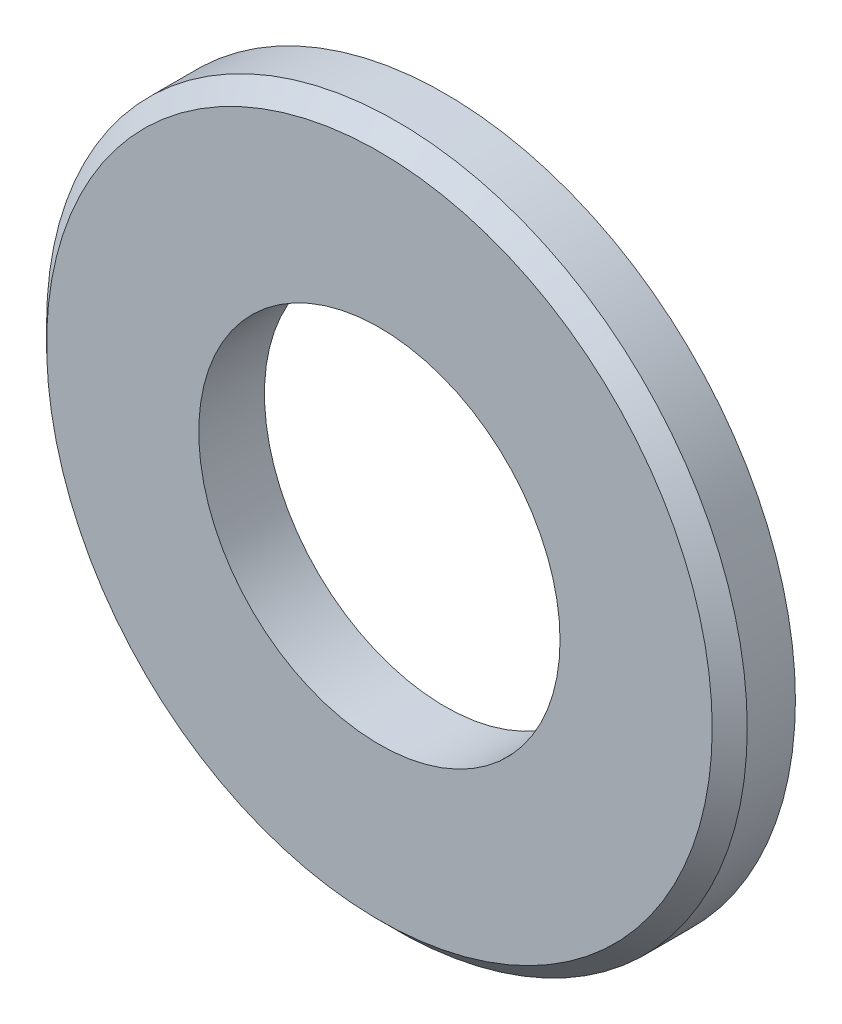
ISO-10303-21;
HEADER;
FILE_DESCRIPTION(('STEP AP214'),'2;1');
FILE_NAME('part.step','',(''),(''),'','','');
FILE_SCHEMA(('AUTOMOTIVE_DESIGN { 1 0 10303 214 1 1 1 1 }'));
ENDSEC;
DATA;
#1=APPLICATION_CONTEXT('core data for automotive mechanical design processes');
#2=APPLICATION_PROTOCOL_DEFINITION('international standard','automotive_design',2000,#1);
#3=PRODUCT_CONTEXT('',#1,'mechanical');
#4=PRODUCT('Part','Part','',(#3));
#5=PRODUCT_RELATED_PRODUCT_CATEGORY('part','',(#4));
#6=PRODUCT_DEFINITION_FORMATION('','',#4);
#7=PRODUCT_DEFINITION_CONTEXT('part definition',#1,'design');
#8=PRODUCT_DEFINITION('design','',#6,#7);
#9=PRODUCT_DEFINITION_SHAPE('','',#8);
#10=(LENGTH_UNIT() NAMED_UNIT(*) SI_UNIT(.MILLI.,.METRE.));
#11=(NAMED_UNIT(*) PLANE_ANGLE_UNIT() SI_UNIT($,.RADIAN.));
#12=(NAMED_UNIT(*) SI_UNIT($,.STERADIAN.) SOLID_ANGLE_UNIT());
#13=UNCERTAINTY_MEASURE_WITH_UNIT(LENGTH_MEASURE(1.E-05),#10,'distance_accuracy_value','');
#14=(GEOMETRIC_REPRESENTATION_CONTEXT(3) GLOBAL_UNCERTAINTY_ASSIGNED_CONTEXT((#13)) GLOBAL_UNIT_ASSIGNED_CONTEXT((#10,
#11,#12)) REPRESENTATION_CONTEXT('',''));
#15=CARTESIAN_POINT('',(0.,0.,0.));
#16=DIRECTION('',(0.,0.,1.));
#17=DIRECTION('',(1.,0.,0.));
#18=AXIS2_PLACEMENT_3D('',#15,#16,#17);
#19=CARTESIAN_POINT('',(10.9282335169734,3.97267864824882,3.00000000000021));
#20=DIRECTION('',(0.,0.,1.));
#21=DIRECTION('',(0.999999999999999,0.,0.));
#22=AXIS2_PLACEMENT_3D('',#19,#20,#21);
#23=PLANE('',#22);
#24=CARTESIAN_POINT('',(10.9282335169734,3.97267864824882,3.00000000000021));
#25=DIRECTION('',(0.,0.,1.));
#26=DIRECTION('',(0.999999999999999,0.,0.));
#27=AXIS2_PLACEMENT_3D('',#24,#25,#26);
#28=CIRCLE('',#27,15.2);
#29=CARTESIAN_POINT('',(26.1282335169734,3.97267864824877,3.00000000000023));
#30=VERTEX_POINT('',#29);
#31=EDGE_CURVE('E50',#30,#30,#28,.T.);
#32=ORIENTED_EDGE('',*,*,#31,.T.);
#33=EDGE_LOOP('',(#32));
#34=FACE_BOUND('',#33,.T.);
#35=CARTESIAN_POINT('',(10.9282335169734,3.97267864824882,3.00000000000021));
#36=DIRECTION('',(0.,0.,1.));
#37=DIRECTION('',(0.999999999999999,0.,0.));
#38=AXIS2_PLACEMENT_3D('',#35,#36,#37);
#39=CIRCLE('',#38,8.25);
#40=CARTESIAN_POINT('',(19.1782335169734,3.97267864824879,3.00000000000022));
#41=VERTEX_POINT('',#40);
#42=EDGE_CURVE('E62',#41,#41,#39,.T.);
#43=ORIENTED_EDGE('',*,*,#42,.F.);
#44=EDGE_LOOP('',(#43));
#45=FACE_BOUND('',#44,.T.);
#46=ADVANCED_FACE('F42',(#34,#45),#23,.T.);
#47=CARTESIAN_POINT('',(10.9282335169734,3.97267864824882,2.08166817117217E-13));
#48=DIRECTION('',(0.,0.,1.));
#49=DIRECTION('',(0.999999999999999,0.,0.));
#50=AXIS2_PLACEMENT_3D('',#47,#48,#49);
#51=PLANE('',#50);
#52=CARTESIAN_POINT('',(10.9282335169734,3.97267864824882,2.08166817117217E-13));
#53=DIRECTION('',(0.,0.,1.));
#54=DIRECTION('',(0.999999999999999,0.,0.));
#55=AXIS2_PLACEMENT_3D('',#52,#53,#54);
#56=CIRCLE('',#55,16.);
#57=CARTESIAN_POINT('',(26.9282335169734,3.97267864824878,2.28833825184018E-13));
#58=VERTEX_POINT('',#57);
#59=EDGE_CURVE('E56',#58,#58,#56,.T.);
#60=ORIENTED_EDGE('',*,*,#59,.F.);
#61=EDGE_LOOP('',(#60));
#62=FACE_BOUND('',#61,.T.);
#63=CARTESIAN_POINT('',(10.9282335169734,3.97267864824882,2.08166817117217E-13));
#64=DIRECTION('',(0.,0.,1.));
#65=DIRECTION('',(0.999999999999999,0.,0.));
#66=AXIS2_PLACEMENT_3D('',#63,#64,#65);
#67=CIRCLE('',#66,8.25);
#68=CARTESIAN_POINT('',(19.1782335169734,3.9726786482488,2.18823243151661E-13));
#69=VERTEX_POINT('',#68);
#70=EDGE_CURVE('E68',#69,#69,#67,.T.);
#71=ORIENTED_EDGE('',*,*,#70,.T.);
#72=EDGE_LOOP('',(#71));
#73=FACE_BOUND('',#72,.T.);
#74=ADVANCED_FACE('F74',(#62,#73),#51,.F.);
#75=CARTESIAN_POINT('',(10.9282335169734,3.97267864824882,3.00000000000021));
#76=DIRECTION('',(0.,0.,-1.));
#77=DIRECTION('',(-0.999999999999999,0.,0.));
#78=AXIS2_PLACEMENT_3D('',#75,#76,#77);
#79=CYLINDRICAL_SURFACE('',#78,16.);
#80=CARTESIAN_POINT('',(10.9282335169734,3.97267864824883,2.2000000000002));
#81=DIRECTION('',(0.,0.,1.));
#82=DIRECTION('',(0.999999999999999,0.,0.));
#83=AXIS2_PLACEMENT_3D('',#80,#81,#82);
#84=CIRCLE('',#83,16.);
#85=CARTESIAN_POINT('',(26.9282335169734,3.97267864824879,2.20000000000022));
#86=VERTEX_POINT('',#85);
#87=EDGE_CURVE('E12',#86,#86,#84,.F.);
#88=ORIENTED_EDGE('',*,*,#87,.T.);
#89=EDGE_LOOP('',(#88));
#90=FACE_BOUND('',#89,.T.);
#91=ORIENTED_EDGE('',*,*,#59,.T.);
#92=EDGE_LOOP('',(#91));
#93=FACE_BOUND('',#92,.T.);
#94=ADVANCED_FACE('F44',(#90,#93),#79,.T.);
#95=CARTESIAN_POINT('',(10.9282335169734,3.97267864824882,3.00000000000021));
#96=DIRECTION('',(0.,0.,-1.));
#97=DIRECTION('',(-0.999999999999999,0.,0.));
#98=AXIS2_PLACEMENT_3D('',#95,#96,#97);
#99=CYLINDRICAL_SURFACE('',#98,8.25);
#100=ORIENTED_EDGE('',*,*,#42,.T.);
#101=EDGE_LOOP('',(#100));
#102=FACE_BOUND('',#101,.T.);
#103=ORIENTED_EDGE('',*,*,#70,.F.);
#104=EDGE_LOOP('',(#103));
#105=FACE_BOUND('',#104,.T.);
#106=ADVANCED_FACE('F76',(#102,#105),#99,.F.);
#107=CARTESIAN_POINT('',(10.9282335169734,3.97267864824882,3.00000000000021));
#108=DIRECTION('',(0.,0.,-1.));
#109=DIRECTION('',(-0.999999999999999,0.,0.));
#110=AXIS2_PLACEMENT_3D('',#107,#108,#109);
#111=CONICAL_SURFACE('',#110,15.2,0.785398163397454);
#112=ORIENTED_EDGE('',*,*,#87,.F.);
#113=EDGE_LOOP('',(#112));
#114=FACE_BOUND('',#113,.T.);
#115=ORIENTED_EDGE('',*,*,#31,.F.);
#116=EDGE_LOOP('',(#115));
#117=FACE_BOUND('',#116,.T.);
#118=ADVANCED_FACE('F78',(#114,#117),#111,.T.);
#119=CLOSED_SHELL('',(#46,#74,#94,#106,#118));
#120=MANIFOLD_SOLID_BREP('B2',#119);
#121=ADVANCED_BREP_SHAPE_REPRESENTATION('',(#18,#120),#14);
#122=SHAPE_DEFINITION_REPRESENTATION(#9,#121);
ENDSEC;
END-ISO-10303-21;
